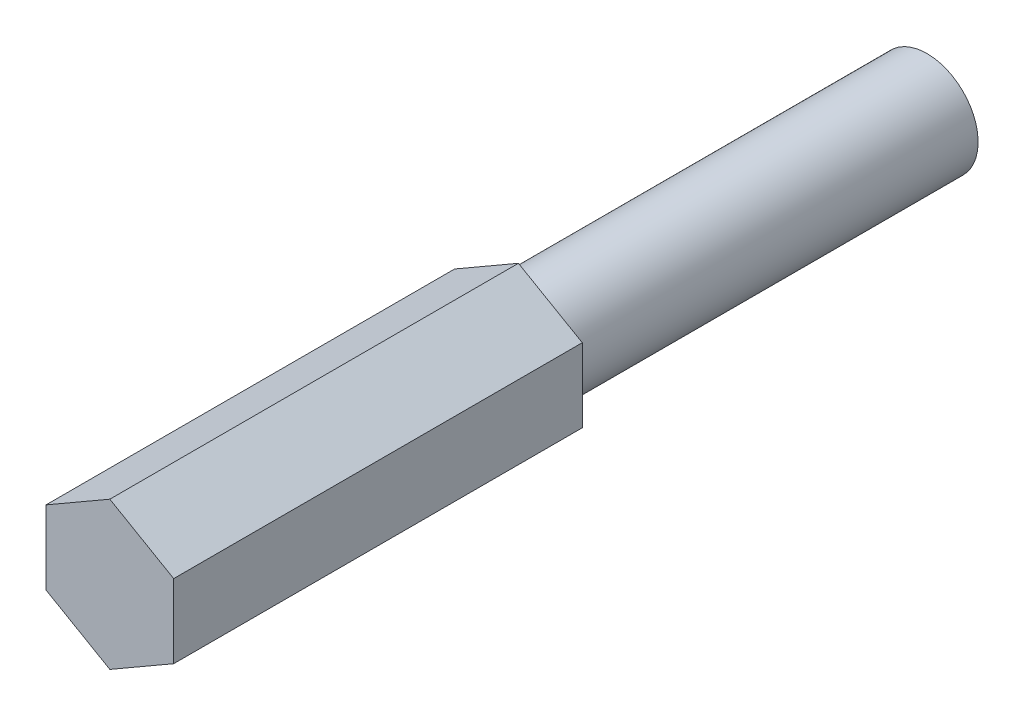
ISO-10303-21;
HEADER;
FILE_DESCRIPTION(('STEP AP214'),'2;1');
FILE_NAME('part.step','',(''),(''),'','','');
FILE_SCHEMA(('AUTOMOTIVE_DESIGN { 1 0 10303 214 1 1 1 1 }'));
ENDSEC;
DATA;
#1=APPLICATION_CONTEXT('core data for automotive mechanical design processes');
#2=APPLICATION_PROTOCOL_DEFINITION('international standard','automotive_design',2000,#1);
#3=PRODUCT_CONTEXT('',#1,'mechanical');
#4=PRODUCT('Part','Part','',(#3));
#5=PRODUCT_RELATED_PRODUCT_CATEGORY('part','',(#4));
#6=PRODUCT_DEFINITION_FORMATION('','',#4);
#7=PRODUCT_DEFINITION_CONTEXT('part definition',#1,'design');
#8=PRODUCT_DEFINITION('design','',#6,#7);
#9=PRODUCT_DEFINITION_SHAPE('','',#8);
#10=(LENGTH_UNIT() NAMED_UNIT(*) SI_UNIT(.MILLI.,.METRE.));
#11=(NAMED_UNIT(*) PLANE_ANGLE_UNIT() SI_UNIT($,.RADIAN.));
#12=(NAMED_UNIT(*) SI_UNIT($,.STERADIAN.) SOLID_ANGLE_UNIT());
#13=UNCERTAINTY_MEASURE_WITH_UNIT(LENGTH_MEASURE(1.E-05),#10,'distance_accuracy_value','');
#14=(GEOMETRIC_REPRESENTATION_CONTEXT(3) GLOBAL_UNCERTAINTY_ASSIGNED_CONTEXT((#13)) GLOBAL_UNIT_ASSIGNED_CONTEXT((#10,
#11,#12)) REPRESENTATION_CONTEXT('',''));
#15=CARTESIAN_POINT('',(0.,0.,0.));
#16=DIRECTION('',(0.,0.,1.));
#17=DIRECTION('',(1.,0.,0.));
#18=AXIS2_PLACEMENT_3D('',#15,#16,#17);
#19=CARTESIAN_POINT('',(3.96874999999998,2.29135888084637,25.4));
#20=DIRECTION('',(-0.499999999999995,-0.866025403784442,0.));
#21=DIRECTION('',(0.866025403784442,-0.499999999999995,0.));
#22=AXIS2_PLACEMENT_3D('',#19,#20,#21);
#23=PLANE('',#22);
#24=DIRECTION('',(-0.866025403784441,0.499999999999995,0.));
#25=VECTOR('',#24,1.);
#26=CARTESIAN_POINT('',(3.96874999999998,2.29135888084637,0.));
#27=LINE('',#26,#25);
#28=CARTESIAN_POINT('',(3.96874999999998,2.29135888084637,0.));
#29=VERTEX_POINT('',#28);
#30=CARTESIAN_POINT('',(0.,4.58271776169266,0.));
#31=VERTEX_POINT('',#30);
#32=EDGE_CURVE('E125',#29,#31,#27,.T.);
#33=ORIENTED_EDGE('',*,*,#32,.T.);
#34=DIRECTION('',(0.,0.,-1.));
#35=VECTOR('',#34,1.);
#36=CARTESIAN_POINT('',(0.,4.58271776169266,25.4));
#37=LINE('',#36,#35);
#38=CARTESIAN_POINT('',(0.,4.58271776169266,25.4));
#39=VERTEX_POINT('',#38);
#40=EDGE_CURVE('E42',#39,#31,#37,.T.);
#41=ORIENTED_EDGE('',*,*,#40,.F.);
#42=DIRECTION('',(-0.866025403784441,0.499999999999995,0.));
#43=VECTOR('',#42,1.);
#44=CARTESIAN_POINT('',(3.96874999999998,2.29135888084637,25.4));
#45=LINE('',#44,#43);
#46=CARTESIAN_POINT('',(3.96874999999998,2.29135888084637,25.4));
#47=VERTEX_POINT('',#46);
#48=EDGE_CURVE('E136',#47,#39,#45,.T.);
#49=ORIENTED_EDGE('',*,*,#48,.F.);
#50=DIRECTION('',(0.,0.,-1.));
#51=VECTOR('',#50,1.);
#52=CARTESIAN_POINT('',(3.96874999999998,2.29135888084637,25.4));
#53=LINE('',#52,#51);
#54=EDGE_CURVE('E121',#47,#29,#53,.T.);
#55=ORIENTED_EDGE('',*,*,#54,.T.);
#56=EDGE_LOOP('',(#33,#41,#49,#55));
#57=FACE_BOUND('',#56,.T.);
#58=ADVANCED_FACE('F39',(#57),#23,.F.);
#59=CARTESIAN_POINT('',(0.,4.58271776169266,25.4));
#60=DIRECTION('',(0.500000000000001,-0.866025403784438,0.));
#61=DIRECTION('',(0.866025403784438,0.500000000000001,0.));
#62=AXIS2_PLACEMENT_3D('',#59,#60,#61);
#63=PLANE('',#62);
#64=DIRECTION('',(-0.866025403784438,-0.500000000000001,0.));
#65=VECTOR('',#64,1.);
#66=CARTESIAN_POINT('',(0.,4.58271776169266,0.));
#67=LINE('',#66,#65);
#68=CARTESIAN_POINT('',(-3.96875000000001,2.29135888084632,0.));
#69=VERTEX_POINT('',#68);
#70=EDGE_CURVE('E128',#31,#69,#67,.T.);
#71=ORIENTED_EDGE('',*,*,#70,.T.);
#72=DIRECTION('',(0.,0.,-1.));
#73=VECTOR('',#72,1.);
#74=CARTESIAN_POINT('',(-3.96875000000001,2.29135888084632,25.4));
#75=LINE('',#74,#73);
#76=CARTESIAN_POINT('',(-3.96875000000001,2.29135888084632,25.4));
#77=VERTEX_POINT('',#76);
#78=EDGE_CURVE('E139',#77,#69,#75,.T.);
#79=ORIENTED_EDGE('',*,*,#78,.F.);
#80=DIRECTION('',(-0.866025403784438,-0.500000000000001,0.));
#81=VECTOR('',#80,1.);
#82=CARTESIAN_POINT('',(0.,4.58271776169266,25.4));
#83=LINE('',#82,#81);
#84=EDGE_CURVE('E94',#39,#77,#83,.T.);
#85=ORIENTED_EDGE('',*,*,#84,.F.);
#86=ORIENTED_EDGE('',*,*,#40,.T.);
#87=EDGE_LOOP('',(#71,#79,#85,#86));
#88=FACE_BOUND('',#87,.T.);
#89=ADVANCED_FACE('F144',(#88),#63,.F.);
#90=CARTESIAN_POINT('',(-3.96875000000001,2.29135888084632,25.4));
#91=DIRECTION('',(1.,0.,0.));
#92=DIRECTION('',(0.,1.,0.));
#93=AXIS2_PLACEMENT_3D('',#90,#91,#92);
#94=PLANE('',#93);
#95=DIRECTION('',(0.,-1.,0.));
#96=VECTOR('',#95,1.);
#97=CARTESIAN_POINT('',(-3.96875000000001,2.29135888084632,0.));
#98=LINE('',#97,#96);
#99=CARTESIAN_POINT('',(-3.96874999999999,-2.29135888084635,0.));
#100=VERTEX_POINT('',#99);
#101=EDGE_CURVE('E131',#69,#100,#98,.T.);
#102=ORIENTED_EDGE('',*,*,#101,.T.);
#103=DIRECTION('',(0.,0.,-1.));
#104=VECTOR('',#103,1.);
#105=CARTESIAN_POINT('',(-3.96874999999999,-2.29135888084635,25.4));
#106=LINE('',#105,#104);
#107=CARTESIAN_POINT('',(-3.96874999999999,-2.29135888084635,25.4));
#108=VERTEX_POINT('',#107);
#109=EDGE_CURVE('E116',#108,#100,#106,.T.);
#110=ORIENTED_EDGE('',*,*,#109,.F.);
#111=DIRECTION('',(0.,-1.,0.));
#112=VECTOR('',#111,1.);
#113=CARTESIAN_POINT('',(-3.96875000000001,2.29135888084632,25.4));
#114=LINE('',#113,#112);
#115=EDGE_CURVE('E107',#77,#108,#114,.T.);
#116=ORIENTED_EDGE('',*,*,#115,.F.);
#117=ORIENTED_EDGE('',*,*,#78,.T.);
#118=EDGE_LOOP('',(#102,#110,#116,#117));
#119=FACE_BOUND('',#118,.T.);
#120=ADVANCED_FACE('F150',(#119),#94,.F.);
#121=CARTESIAN_POINT('',(-3.96874999999999,-2.29135888084635,25.4));
#122=DIRECTION('',(0.499999999999995,0.866025403784442,0.));
#123=DIRECTION('',(-0.866025403784442,0.499999999999995,0.));
#124=AXIS2_PLACEMENT_3D('',#121,#122,#123);
#125=PLANE('',#124);
#126=DIRECTION('',(0.866025403784441,-0.499999999999995,0.));
#127=VECTOR('',#126,1.);
#128=CARTESIAN_POINT('',(-3.96874999999999,-2.29135888084635,0.));
#129=LINE('',#128,#127);
#130=CARTESIAN_POINT('',(0.,-4.58271776169266,0.));
#131=VERTEX_POINT('',#130);
#132=EDGE_CURVE('E115',#100,#131,#129,.T.);
#133=ORIENTED_EDGE('',*,*,#132,.T.);
#134=DIRECTION('',(0.,0.,-1.));
#135=VECTOR('',#134,1.);
#136=CARTESIAN_POINT('',(0.,-4.58271776169266,25.4));
#137=LINE('',#136,#135);
#138=CARTESIAN_POINT('',(0.,-4.58271776169266,25.4));
#139=VERTEX_POINT('',#138);
#140=EDGE_CURVE('E112',#139,#131,#137,.T.);
#141=ORIENTED_EDGE('',*,*,#140,.F.);
#142=DIRECTION('',(0.866025403784441,-0.499999999999995,0.));
#143=VECTOR('',#142,1.);
#144=CARTESIAN_POINT('',(-3.96874999999999,-2.29135888084635,25.4));
#145=LINE('',#144,#143);
#146=EDGE_CURVE('E101',#108,#139,#145,.T.);
#147=ORIENTED_EDGE('',*,*,#146,.F.);
#148=ORIENTED_EDGE('',*,*,#109,.T.);
#149=EDGE_LOOP('',(#133,#141,#147,#148));
#150=FACE_BOUND('',#149,.T.);
#151=ADVANCED_FACE('F113',(#150),#125,.F.);
#152=CARTESIAN_POINT('',(0.,-4.58271776169266,25.4));
#153=DIRECTION('',(-0.500000000000007,0.866025403784435,0.));
#154=DIRECTION('',(-0.866025403784435,-0.500000000000007,0.));
#155=AXIS2_PLACEMENT_3D('',#152,#153,#154);
#156=PLANE('',#155);
#157=DIRECTION('',(0.866025403784434,0.500000000000007,0.));
#158=VECTOR('',#157,1.);
#159=CARTESIAN_POINT('',(0.,-4.58271776169266,0.));
#160=LINE('',#159,#158);
#161=CARTESIAN_POINT('',(3.96875000000002,-2.29135888084629,0.));
#162=VERTEX_POINT('',#161);
#163=EDGE_CURVE('E79',#131,#162,#160,.T.);
#164=ORIENTED_EDGE('',*,*,#163,.T.);
#165=DIRECTION('',(0.,0.,-1.));
#166=VECTOR('',#165,1.);
#167=CARTESIAN_POINT('',(3.96875000000002,-2.29135888084629,25.4));
#168=LINE('',#167,#166);
#169=CARTESIAN_POINT('',(3.96875000000002,-2.29135888084629,25.4));
#170=VERTEX_POINT('',#169);
#171=EDGE_CURVE('E117',#170,#162,#168,.T.);
#172=ORIENTED_EDGE('',*,*,#171,.F.);
#173=DIRECTION('',(0.866025403784434,0.500000000000007,0.));
#174=VECTOR('',#173,1.);
#175=CARTESIAN_POINT('',(0.,-4.58271776169266,25.4));
#176=LINE('',#175,#174);
#177=EDGE_CURVE('E105',#139,#170,#176,.T.);
#178=ORIENTED_EDGE('',*,*,#177,.F.);
#179=ORIENTED_EDGE('',*,*,#140,.T.);
#180=EDGE_LOOP('',(#164,#172,#178,#179));
#181=FACE_BOUND('',#180,.T.);
#182=ADVANCED_FACE('F119',(#181),#156,.F.);
#183=CARTESIAN_POINT('',(3.96875000000002,-2.29135888084629,25.4));
#184=DIRECTION('',(-1.,0.,0.));
#185=DIRECTION('',(0.,-1.,0.));
#186=AXIS2_PLACEMENT_3D('',#183,#184,#185);
#187=PLANE('',#186);
#188=DIRECTION('',(0.,1.,0.));
#189=VECTOR('',#188,1.);
#190=CARTESIAN_POINT('',(3.96875000000002,-2.29135888084629,0.));
#191=LINE('',#190,#189);
#192=EDGE_CURVE('E85',#162,#29,#191,.T.);
#193=ORIENTED_EDGE('',*,*,#192,.T.);
#194=ORIENTED_EDGE('',*,*,#54,.F.);
#195=DIRECTION('',(0.,1.,0.));
#196=VECTOR('',#195,1.);
#197=CARTESIAN_POINT('',(3.96875000000002,-2.29135888084629,25.4));
#198=LINE('',#197,#196);
#199=EDGE_CURVE('E56',#170,#47,#198,.T.);
#200=ORIENTED_EDGE('',*,*,#199,.F.);
#201=ORIENTED_EDGE('',*,*,#171,.T.);
#202=EDGE_LOOP('',(#193,#194,#200,#201));
#203=FACE_BOUND('',#202,.T.);
#204=ADVANCED_FACE('F170',(#203),#187,.F.);
#205=CARTESIAN_POINT('',(0.,0.,25.4));
#206=DIRECTION('',(0.,0.,1.));
#207=DIRECTION('',(1.,0.,0.));
#208=AXIS2_PLACEMENT_3D('',#205,#206,#207);
#209=PLANE('',#208);
#210=ORIENTED_EDGE('',*,*,#48,.T.);
#211=ORIENTED_EDGE('',*,*,#84,.T.);
#212=ORIENTED_EDGE('',*,*,#115,.T.);
#213=ORIENTED_EDGE('',*,*,#146,.T.);
#214=ORIENTED_EDGE('',*,*,#177,.T.);
#215=ORIENTED_EDGE('',*,*,#199,.T.);
#216=EDGE_LOOP('',(#210,#211,#212,#213,#214,#215));
#217=FACE_BOUND('',#216,.T.);
#218=ADVANCED_FACE('F103',(#217),#209,.T.);
#219=CARTESIAN_POINT('',(0.,0.,0.));
#220=DIRECTION('',(0.,0.,1.));
#221=DIRECTION('',(1.,0.,0.));
#222=AXIS2_PLACEMENT_3D('',#219,#220,#221);
#223=PLANE('',#222);
#224=CARTESIAN_POINT('',(0.,0.,0.));
#225=DIRECTION('',(0.,0.,-1.));
#226=DIRECTION('',(-1.,0.,0.));
#227=AXIS2_PLACEMENT_3D('',#224,#225,#226);
#228=CIRCLE('',#227,3.175);
#229=CARTESIAN_POINT('',(-3.175,0.,0.));
#230=VERTEX_POINT('',#229);
#231=EDGE_CURVE('E11',#230,#230,#228,.T.);
#232=ORIENTED_EDGE('',*,*,#231,.F.);
#233=EDGE_LOOP('',(#232));
#234=FACE_BOUND('',#233,.T.);
#235=ORIENTED_EDGE('',*,*,#32,.F.);
#236=ORIENTED_EDGE('',*,*,#192,.F.);
#237=ORIENTED_EDGE('',*,*,#163,.F.);
#238=ORIENTED_EDGE('',*,*,#132,.F.);
#239=ORIENTED_EDGE('',*,*,#101,.F.);
#240=ORIENTED_EDGE('',*,*,#70,.F.);
#241=EDGE_LOOP('',(#235,#236,#237,#238,#239,#240));
#242=FACE_BOUND('',#241,.T.);
#243=ADVANCED_FACE('F149',(#234,#242),#223,.F.);
#244=CARTESIAN_POINT('',(0.,0.,-25.4));
#245=DIRECTION('',(0.,0.,1.));
#246=DIRECTION('',(1.,0.,0.));
#247=AXIS2_PLACEMENT_3D('',#244,#245,#246);
#248=CYLINDRICAL_SURFACE('',#247,3.175);
#249=CARTESIAN_POINT('',(0.,0.,-25.4));
#250=DIRECTION('',(0.,0.,-1.));
#251=DIRECTION('',(-1.,0.,0.));
#252=AXIS2_PLACEMENT_3D('',#249,#250,#251);
#253=CIRCLE('',#252,3.175);
#254=CARTESIAN_POINT('',(-3.175,0.,-25.4));
#255=VERTEX_POINT('',#254);
#256=EDGE_CURVE('E129',#255,#255,#253,.T.);
#257=ORIENTED_EDGE('',*,*,#256,.F.);
#258=EDGE_LOOP('',(#257));
#259=FACE_BOUND('',#258,.T.);
#260=ORIENTED_EDGE('',*,*,#231,.T.);
#261=EDGE_LOOP('',(#260));
#262=FACE_BOUND('',#261,.T.);
#263=ADVANCED_FACE('F159',(#259,#262),#248,.T.);
#264=CARTESIAN_POINT('',(0.,0.,-25.4));
#265=DIRECTION('',(0.,0.,-1.));
#266=DIRECTION('',(-1.,0.,0.));
#267=AXIS2_PLACEMENT_3D('',#264,#265,#266);
#268=PLANE('',#267);
#269=ORIENTED_EDGE('',*,*,#256,.T.);
#270=EDGE_LOOP('',(#269));
#271=FACE_BOUND('',#270,.T.);
#272=ADVANCED_FACE('F157',(#271),#268,.T.);
#273=CLOSED_SHELL('',(#58,#89,#120,#151,#182,#204,#218,#243,#263,#272));
#274=MANIFOLD_SOLID_BREP('B2',#273);
#275=ADVANCED_BREP_SHAPE_REPRESENTATION('',(#18,#274),#14);
#276=SHAPE_DEFINITION_REPRESENTATION(#9,#275);
ENDSEC;
END-ISO-10303-21;
